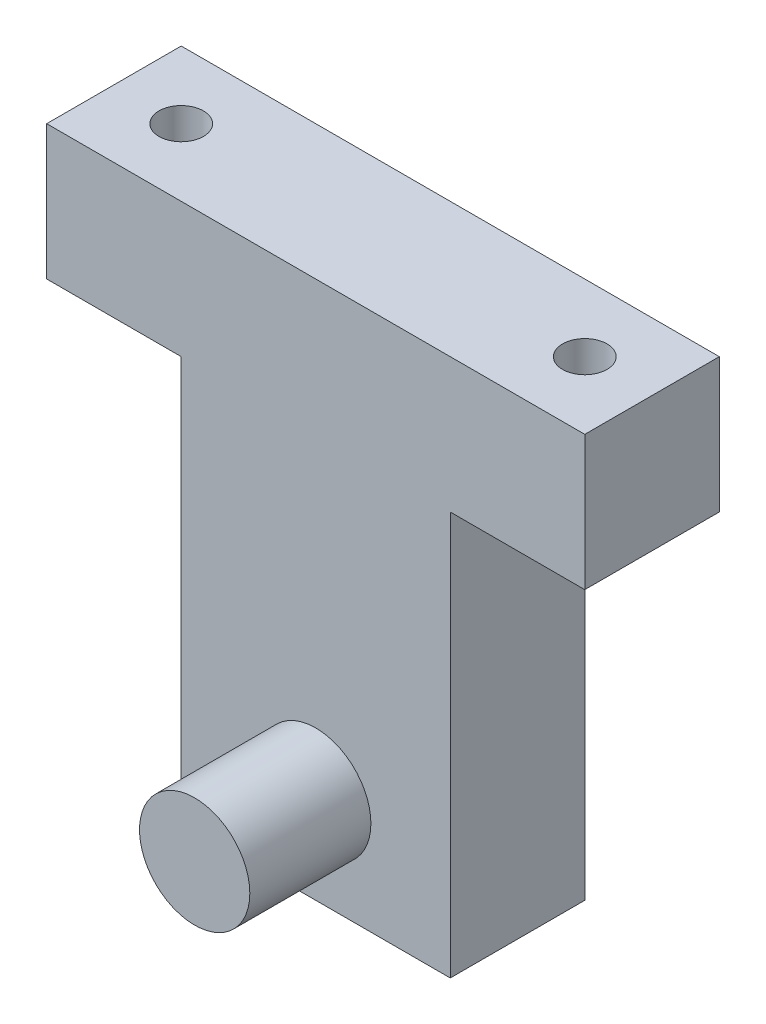
ISO-10303-21;
HEADER;
FILE_DESCRIPTION(('STEP AP214'),'2;1');
FILE_NAME('part.step','',(''),(''),'','','');
FILE_SCHEMA(('AUTOMOTIVE_DESIGN { 1 0 10303 214 1 1 1 1 }'));
ENDSEC;
DATA;
#1=APPLICATION_CONTEXT('core data for automotive mechanical design processes');
#2=APPLICATION_PROTOCOL_DEFINITION('international standard','automotive_design',2000,#1);
#3=PRODUCT_CONTEXT('',#1,'mechanical');
#4=PRODUCT('Part','Part','',(#3));
#5=PRODUCT_RELATED_PRODUCT_CATEGORY('part','',(#4));
#6=PRODUCT_DEFINITION_FORMATION('','',#4);
#7=PRODUCT_DEFINITION_CONTEXT('part definition',#1,'design');
#8=PRODUCT_DEFINITION('design','',#6,#7);
#9=PRODUCT_DEFINITION_SHAPE('','',#8);
#10=(LENGTH_UNIT() NAMED_UNIT(*) SI_UNIT(.MILLI.,.METRE.));
#11=(NAMED_UNIT(*) PLANE_ANGLE_UNIT() SI_UNIT($,.RADIAN.));
#12=(NAMED_UNIT(*) SI_UNIT($,.STERADIAN.) SOLID_ANGLE_UNIT());
#13=UNCERTAINTY_MEASURE_WITH_UNIT(LENGTH_MEASURE(1.E-05),#10,'distance_accuracy_value','');
#14=(GEOMETRIC_REPRESENTATION_CONTEXT(3) GLOBAL_UNCERTAINTY_ASSIGNED_CONTEXT((#13)) GLOBAL_UNIT_ASSIGNED_CONTEXT((#10,
#11,#12)) REPRESENTATION_CONTEXT('',''));
#15=CARTESIAN_POINT('',(0.,0.,0.));
#16=DIRECTION('',(0.,0.,1.));
#17=DIRECTION('',(1.,0.,0.));
#18=AXIS2_PLACEMENT_3D('',#15,#16,#17);
#19=CARTESIAN_POINT('',(0.,20.,10.));
#20=DIRECTION('',(0.,-1.,0.));
#21=DIRECTION('',(0.,0.,-1.));
#22=AXIS2_PLACEMENT_3D('',#19,#20,#21);
#23=PLANE('',#22);
#24=CARTESIAN_POINT('',(-15.,20.,5.));
#25=DIRECTION('',(0.,1.,0.));
#26=DIRECTION('',(0.,0.,1.));
#27=AXIS2_PLACEMENT_3D('',#24,#25,#26);
#28=CIRCLE('',#27,1.65);
#29=CARTESIAN_POINT('',(-15.,20.,6.65));
#30=VERTEX_POINT('',#29);
#31=EDGE_CURVE('E223',#30,#30,#28,.T.);
#32=ORIENTED_EDGE('',*,*,#31,.F.);
#33=EDGE_LOOP('',(#32));
#34=FACE_BOUND('',#33,.T.);
#35=CARTESIAN_POINT('',(15.,20.,5.));
#36=DIRECTION('',(0.,1.,0.));
#37=DIRECTION('',(0.,0.,-1.));
#38=AXIS2_PLACEMENT_3D('',#35,#36,#37);
#39=CIRCLE('',#38,1.65);
#40=CARTESIAN_POINT('',(15.,20.,3.35));
#41=VERTEX_POINT('',#40);
#42=EDGE_CURVE('E236',#41,#41,#39,.T.);
#43=ORIENTED_EDGE('',*,*,#42,.F.);
#44=EDGE_LOOP('',(#43));
#45=FACE_BOUND('',#44,.T.);
#46=DIRECTION('',(-1.,0.,0.));
#47=VECTOR('',#46,1.);
#48=CARTESIAN_POINT('',(0.,20.,0.));
#49=LINE('',#48,#47);
#50=CARTESIAN_POINT('',(20.,20.,0.));
#51=VERTEX_POINT('',#50);
#52=CARTESIAN_POINT('',(-20.,20.,0.));
#53=VERTEX_POINT('',#52);
#54=EDGE_CURVE('E151',#51,#53,#49,.T.);
#55=ORIENTED_EDGE('',*,*,#54,.T.);
#56=DIRECTION('',(0.,0.,-1.));
#57=VECTOR('',#56,1.);
#58=CARTESIAN_POINT('',(-20.,20.,10.));
#59=LINE('',#58,#57);
#60=CARTESIAN_POINT('',(-20.,20.,10.));
#61=VERTEX_POINT('',#60);
#62=EDGE_CURVE('E11',#61,#53,#59,.T.);
#63=ORIENTED_EDGE('',*,*,#62,.F.);
#64=DIRECTION('',(-1.,0.,0.));
#65=VECTOR('',#64,1.);
#66=CARTESIAN_POINT('',(0.,20.,10.));
#67=LINE('',#66,#65);
#68=CARTESIAN_POINT('',(20.,20.,10.));
#69=VERTEX_POINT('',#68);
#70=EDGE_CURVE('E178',#69,#61,#67,.T.);
#71=ORIENTED_EDGE('',*,*,#70,.F.);
#72=DIRECTION('',(0.,0.,-1.));
#73=VECTOR('',#72,1.);
#74=CARTESIAN_POINT('',(20.,20.,10.));
#75=LINE('',#74,#73);
#76=EDGE_CURVE('E62',#69,#51,#75,.T.);
#77=ORIENTED_EDGE('',*,*,#76,.T.);
#78=EDGE_LOOP('',(#55,#63,#71,#77));
#79=FACE_BOUND('',#78,.T.);
#80=ADVANCED_FACE('F45',(#34,#45,#79),#23,.F.);
#81=CARTESIAN_POINT('',(-20.,0.,10.));
#82=DIRECTION('',(1.,0.,0.));
#83=DIRECTION('',(0.,1.,0.));
#84=AXIS2_PLACEMENT_3D('',#81,#82,#83);
#85=PLANE('',#84);
#86=DIRECTION('',(0.,-1.,0.));
#87=VECTOR('',#86,1.);
#88=CARTESIAN_POINT('',(-20.,0.,0.));
#89=LINE('',#88,#87);
#90=CARTESIAN_POINT('',(-20.,10.,0.));
#91=VERTEX_POINT('',#90);
#92=EDGE_CURVE('E154',#53,#91,#89,.T.);
#93=ORIENTED_EDGE('',*,*,#92,.T.);
#94=DIRECTION('',(0.,0.,-1.));
#95=VECTOR('',#94,1.);
#96=CARTESIAN_POINT('',(-20.,10.,10.));
#97=LINE('',#96,#95);
#98=CARTESIAN_POINT('',(-20.,10.,10.));
#99=VERTEX_POINT('',#98);
#100=EDGE_CURVE('E54',#99,#91,#97,.T.);
#101=ORIENTED_EDGE('',*,*,#100,.F.);
#102=DIRECTION('',(0.,-1.,0.));
#103=VECTOR('',#102,1.);
#104=CARTESIAN_POINT('',(-20.,0.,10.));
#105=LINE('',#104,#103);
#106=EDGE_CURVE('E101',#61,#99,#105,.T.);
#107=ORIENTED_EDGE('',*,*,#106,.F.);
#108=ORIENTED_EDGE('',*,*,#62,.T.);
#109=EDGE_LOOP('',(#93,#101,#107,#108));
#110=FACE_BOUND('',#109,.T.);
#111=ADVANCED_FACE('F198',(#110),#85,.F.);
#112=CARTESIAN_POINT('',(0.,10.,10.));
#113=DIRECTION('',(0.,-1.,0.));
#114=DIRECTION('',(1.,0.,0.));
#115=AXIS2_PLACEMENT_3D('',#112,#113,#114);
#116=PLANE('',#115);
#117=CARTESIAN_POINT('',(-15.,10.,5.));
#118=DIRECTION('',(0.,1.,0.));
#119=DIRECTION('',(0.,0.,1.));
#120=AXIS2_PLACEMENT_3D('',#117,#118,#119);
#121=CIRCLE('',#120,1.65);
#122=CARTESIAN_POINT('',(-15.,10.,6.65));
#123=VERTEX_POINT('',#122);
#124=EDGE_CURVE('E226',#123,#123,#121,.T.);
#125=ORIENTED_EDGE('',*,*,#124,.T.);
#126=EDGE_LOOP('',(#125));
#127=FACE_BOUND('',#126,.T.);
#128=DIRECTION('',(-1.,0.,0.));
#129=VECTOR('',#128,1.);
#130=CARTESIAN_POINT('',(0.,10.,0.));
#131=LINE('',#130,#129);
#132=CARTESIAN_POINT('',(-10.,10.,0.));
#133=VERTEX_POINT('',#132);
#134=EDGE_CURVE('E159',#133,#91,#131,.T.);
#135=ORIENTED_EDGE('',*,*,#134,.F.);
#136=DIRECTION('',(0.,0.,-1.));
#137=VECTOR('',#136,1.);
#138=CARTESIAN_POINT('',(-10.,10.,10.));
#139=LINE('',#138,#137);
#140=CARTESIAN_POINT('',(-10.,10.,10.));
#141=VERTEX_POINT('',#140);
#142=EDGE_CURVE('E188',#141,#133,#139,.T.);
#143=ORIENTED_EDGE('',*,*,#142,.F.);
#144=DIRECTION('',(-1.,0.,0.));
#145=VECTOR('',#144,1.);
#146=CARTESIAN_POINT('',(0.,10.,10.));
#147=LINE('',#146,#145);
#148=EDGE_CURVE('E197',#141,#99,#147,.T.);
#149=ORIENTED_EDGE('',*,*,#148,.T.);
#150=ORIENTED_EDGE('',*,*,#100,.T.);
#151=EDGE_LOOP('',(#135,#143,#149,#150));
#152=FACE_BOUND('',#151,.T.);
#153=ADVANCED_FACE('F195',(#127,#152),#116,.T.);
#154=CARTESIAN_POINT('',(-10.,0.,10.));
#155=DIRECTION('',(-1.,0.,0.));
#156=DIRECTION('',(0.,0.,1.));
#157=AXIS2_PLACEMENT_3D('',#154,#155,#156);
#158=PLANE('',#157);
#159=DIRECTION('',(0.,1.,0.));
#160=VECTOR('',#159,1.);
#161=CARTESIAN_POINT('',(-10.,0.,0.));
#162=LINE('',#161,#160);
#163=CARTESIAN_POINT('',(-10.,-20.,0.));
#164=VERTEX_POINT('',#163);
#165=EDGE_CURVE('E163',#164,#133,#162,.T.);
#166=ORIENTED_EDGE('',*,*,#165,.F.);
#167=DIRECTION('',(0.,0.,-1.));
#168=VECTOR('',#167,1.);
#169=CARTESIAN_POINT('',(-10.,-20.,10.));
#170=LINE('',#169,#168);
#171=CARTESIAN_POINT('',(-10.,-20.,10.));
#172=VERTEX_POINT('',#171);
#173=EDGE_CURVE('E185',#172,#164,#170,.T.);
#174=ORIENTED_EDGE('',*,*,#173,.F.);
#175=DIRECTION('',(0.,1.,0.));
#176=VECTOR('',#175,1.);
#177=CARTESIAN_POINT('',(-10.,0.,10.));
#178=LINE('',#177,#176);
#179=EDGE_CURVE('E207',#172,#141,#178,.T.);
#180=ORIENTED_EDGE('',*,*,#179,.T.);
#181=ORIENTED_EDGE('',*,*,#142,.T.);
#182=EDGE_LOOP('',(#166,#174,#180,#181));
#183=FACE_BOUND('',#182,.T.);
#184=ADVANCED_FACE('F205',(#183),#158,.T.);
#185=CARTESIAN_POINT('',(0.,-20.,10.));
#186=DIRECTION('',(0.,1.,0.));
#187=DIRECTION('',(0.,0.,1.));
#188=AXIS2_PLACEMENT_3D('',#185,#186,#187);
#189=PLANE('',#188);
#190=DIRECTION('',(1.,0.,0.));
#191=VECTOR('',#190,1.);
#192=CARTESIAN_POINT('',(0.,-20.,0.));
#193=LINE('',#192,#191);
#194=CARTESIAN_POINT('',(10.,-20.,0.));
#195=VERTEX_POINT('',#194);
#196=EDGE_CURVE('E166',#164,#195,#193,.T.);
#197=ORIENTED_EDGE('',*,*,#196,.T.);
#198=DIRECTION('',(0.,0.,-1.));
#199=VECTOR('',#198,1.);
#200=CARTESIAN_POINT('',(10.,-20.,10.));
#201=LINE('',#200,#199);
#202=CARTESIAN_POINT('',(10.,-20.,10.));
#203=VERTEX_POINT('',#202);
#204=EDGE_CURVE('E138',#203,#195,#201,.T.);
#205=ORIENTED_EDGE('',*,*,#204,.F.);
#206=DIRECTION('',(1.,0.,0.));
#207=VECTOR('',#206,1.);
#208=CARTESIAN_POINT('',(0.,-20.,10.));
#209=LINE('',#208,#207);
#210=EDGE_CURVE('E124',#172,#203,#209,.T.);
#211=ORIENTED_EDGE('',*,*,#210,.F.);
#212=ORIENTED_EDGE('',*,*,#173,.T.);
#213=EDGE_LOOP('',(#197,#205,#211,#212));
#214=FACE_BOUND('',#213,.T.);
#215=ADVANCED_FACE('F366',(#214),#189,.F.);
#216=CARTESIAN_POINT('',(10.,0.,10.));
#217=DIRECTION('',(-1.,0.,0.));
#218=DIRECTION('',(0.,0.,1.));
#219=AXIS2_PLACEMENT_3D('',#216,#217,#218);
#220=PLANE('',#219);
#221=DIRECTION('',(0.,1.,0.));
#222=VECTOR('',#221,1.);
#223=CARTESIAN_POINT('',(10.,0.,0.));
#224=LINE('',#223,#222);
#225=CARTESIAN_POINT('',(10.,10.,0.));
#226=VERTEX_POINT('',#225);
#227=EDGE_CURVE('E134',#195,#226,#224,.T.);
#228=ORIENTED_EDGE('',*,*,#227,.T.);
#229=DIRECTION('',(0.,0.,-1.));
#230=VECTOR('',#229,1.);
#231=CARTESIAN_POINT('',(10.,10.,10.));
#232=LINE('',#231,#230);
#233=CARTESIAN_POINT('',(10.,10.,10.));
#234=VERTEX_POINT('',#233);
#235=EDGE_CURVE('E131',#234,#226,#232,.T.);
#236=ORIENTED_EDGE('',*,*,#235,.F.);
#237=DIRECTION('',(0.,1.,0.));
#238=VECTOR('',#237,1.);
#239=CARTESIAN_POINT('',(10.,0.,10.));
#240=LINE('',#239,#238);
#241=EDGE_CURVE('E116',#203,#234,#240,.T.);
#242=ORIENTED_EDGE('',*,*,#241,.F.);
#243=ORIENTED_EDGE('',*,*,#204,.T.);
#244=EDGE_LOOP('',(#228,#236,#242,#243));
#245=FACE_BOUND('',#244,.T.);
#246=ADVANCED_FACE('F132',(#245),#220,.F.);
#247=CARTESIAN_POINT('',(0.,10.,10.));
#248=DIRECTION('',(0.,1.,0.));
#249=DIRECTION('',(0.,0.,1.));
#250=AXIS2_PLACEMENT_3D('',#247,#248,#249);
#251=PLANE('',#250);
#252=CARTESIAN_POINT('',(15.,10.,5.));
#253=DIRECTION('',(0.,1.,0.));
#254=DIRECTION('',(0.,0.,-1.));
#255=AXIS2_PLACEMENT_3D('',#252,#253,#254);
#256=CIRCLE('',#255,1.65);
#257=CARTESIAN_POINT('',(15.,10.,3.35));
#258=VERTEX_POINT('',#257);
#259=EDGE_CURVE('E227',#258,#258,#256,.T.);
#260=ORIENTED_EDGE('',*,*,#259,.T.);
#261=EDGE_LOOP('',(#260));
#262=FACE_BOUND('',#261,.T.);
#263=DIRECTION('',(1.,0.,0.));
#264=VECTOR('',#263,1.);
#265=CARTESIAN_POINT('',(0.,10.,0.));
#266=LINE('',#265,#264);
#267=CARTESIAN_POINT('',(20.,10.,0.));
#268=VERTEX_POINT('',#267);
#269=EDGE_CURVE('E171',#226,#268,#266,.T.);
#270=ORIENTED_EDGE('',*,*,#269,.T.);
#271=DIRECTION('',(0.,0.,-1.));
#272=VECTOR('',#271,1.);
#273=CARTESIAN_POINT('',(20.,10.,10.));
#274=LINE('',#273,#272);
#275=CARTESIAN_POINT('',(20.,10.,10.));
#276=VERTEX_POINT('',#275);
#277=EDGE_CURVE('E89',#276,#268,#274,.T.);
#278=ORIENTED_EDGE('',*,*,#277,.F.);
#279=DIRECTION('',(1.,0.,0.));
#280=VECTOR('',#279,1.);
#281=CARTESIAN_POINT('',(0.,10.,10.));
#282=LINE('',#281,#280);
#283=EDGE_CURVE('E121',#234,#276,#282,.T.);
#284=ORIENTED_EDGE('',*,*,#283,.F.);
#285=ORIENTED_EDGE('',*,*,#235,.T.);
#286=EDGE_LOOP('',(#270,#278,#284,#285));
#287=FACE_BOUND('',#286,.T.);
#288=ADVANCED_FACE('F140',(#262,#287),#251,.F.);
#289=CARTESIAN_POINT('',(20.,0.,10.));
#290=DIRECTION('',(1.,0.,0.));
#291=DIRECTION('',(0.,1.,0.));
#292=AXIS2_PLACEMENT_3D('',#289,#290,#291);
#293=PLANE('',#292);
#294=DIRECTION('',(0.,-1.,0.));
#295=VECTOR('',#294,1.);
#296=CARTESIAN_POINT('',(20.,0.,0.));
#297=LINE('',#296,#295);
#298=EDGE_CURVE('E174',#51,#268,#297,.T.);
#299=ORIENTED_EDGE('',*,*,#298,.F.);
#300=ORIENTED_EDGE('',*,*,#76,.F.);
#301=DIRECTION('',(0.,-1.,0.));
#302=VECTOR('',#301,1.);
#303=CARTESIAN_POINT('',(20.,0.,10.));
#304=LINE('',#303,#302);
#305=EDGE_CURVE('E142',#69,#276,#304,.T.);
#306=ORIENTED_EDGE('',*,*,#305,.T.);
#307=ORIENTED_EDGE('',*,*,#277,.T.);
#308=EDGE_LOOP('',(#299,#300,#306,#307));
#309=FACE_BOUND('',#308,.T.);
#310=ADVANCED_FACE('F266',(#309),#293,.T.);
#311=CARTESIAN_POINT('',(0.,0.,10.));
#312=DIRECTION('',(0.,0.,1.));
#313=DIRECTION('',(1.,0.,0.));
#314=AXIS2_PLACEMENT_3D('',#311,#312,#313);
#315=PLANE('',#314);
#316=CARTESIAN_POINT('',(0.,-13.,10.));
#317=DIRECTION('',(0.,0.,1.));
#318=DIRECTION('',(1.,0.,0.));
#319=AXIS2_PLACEMENT_3D('',#316,#317,#318);
#320=CIRCLE('',#319,4.1);
#321=CARTESIAN_POINT('',(4.1,-13.,10.));
#322=VERTEX_POINT('',#321);
#323=EDGE_CURVE('E249',#322,#322,#320,.T.);
#324=ORIENTED_EDGE('',*,*,#323,.F.);
#325=EDGE_LOOP('',(#324));
#326=FACE_BOUND('',#325,.T.);
#327=ORIENTED_EDGE('',*,*,#70,.T.);
#328=ORIENTED_EDGE('',*,*,#106,.T.);
#329=ORIENTED_EDGE('',*,*,#148,.F.);
#330=ORIENTED_EDGE('',*,*,#179,.F.);
#331=ORIENTED_EDGE('',*,*,#210,.T.);
#332=ORIENTED_EDGE('',*,*,#241,.T.);
#333=ORIENTED_EDGE('',*,*,#283,.T.);
#334=ORIENTED_EDGE('',*,*,#305,.F.);
#335=EDGE_LOOP('',(#327,#328,#329,#330,#331,#332,#333,#334));
#336=FACE_BOUND('',#335,.T.);
#337=ADVANCED_FACE('F118',(#326,#336),#315,.T.);
#338=CARTESIAN_POINT('',(0.,0.,0.));
#339=DIRECTION('',(0.,0.,1.));
#340=DIRECTION('',(1.,0.,0.));
#341=AXIS2_PLACEMENT_3D('',#338,#339,#340);
#342=PLANE('',#341);
#343=ORIENTED_EDGE('',*,*,#54,.F.);
#344=ORIENTED_EDGE('',*,*,#298,.T.);
#345=ORIENTED_EDGE('',*,*,#269,.F.);
#346=ORIENTED_EDGE('',*,*,#227,.F.);
#347=ORIENTED_EDGE('',*,*,#196,.F.);
#348=ORIENTED_EDGE('',*,*,#165,.T.);
#349=ORIENTED_EDGE('',*,*,#134,.T.);
#350=ORIENTED_EDGE('',*,*,#92,.F.);
#351=EDGE_LOOP('',(#343,#344,#345,#346,#347,#348,#349,#350));
#352=FACE_BOUND('',#351,.T.);
#353=ADVANCED_FACE('F201',(#352),#342,.F.);
#354=CARTESIAN_POINT('',(0.,-13.,19.));
#355=DIRECTION('',(0.,0.,-1.));
#356=DIRECTION('',(-1.,0.,0.));
#357=AXIS2_PLACEMENT_3D('',#354,#355,#356);
#358=CYLINDRICAL_SURFACE('',#357,4.1);
#359=CARTESIAN_POINT('',(0.,-13.,19.));
#360=DIRECTION('',(0.,0.,1.));
#361=DIRECTION('',(1.,0.,0.));
#362=AXIS2_PLACEMENT_3D('',#359,#360,#361);
#363=CIRCLE('',#362,4.1);
#364=CARTESIAN_POINT('',(4.1,-13.,19.));
#365=VERTEX_POINT('',#364);
#366=EDGE_CURVE('E155',#365,#365,#363,.T.);
#367=ORIENTED_EDGE('',*,*,#366,.F.);
#368=EDGE_LOOP('',(#367));
#369=FACE_BOUND('',#368,.T.);
#370=ORIENTED_EDGE('',*,*,#323,.T.);
#371=EDGE_LOOP('',(#370));
#372=FACE_BOUND('',#371,.T.);
#373=ADVANCED_FACE('F299',(#369,#372),#358,.T.);
#374=CARTESIAN_POINT('',(0.,-13.,19.));
#375=DIRECTION('',(0.,0.,1.));
#376=DIRECTION('',(1.,0.,0.));
#377=AXIS2_PLACEMENT_3D('',#374,#375,#376);
#378=PLANE('',#377);
#379=ORIENTED_EDGE('',*,*,#366,.T.);
#380=EDGE_LOOP('',(#379));
#381=FACE_BOUND('',#380,.T.);
#382=ADVANCED_FACE('F290',(#381),#378,.T.);
#383=CARTESIAN_POINT('',(15.,10.,5.));
#384=DIRECTION('',(0.,1.,0.));
#385=DIRECTION('',(0.,0.,1.));
#386=AXIS2_PLACEMENT_3D('',#383,#384,#385);
#387=CYLINDRICAL_SURFACE('',#386,1.65);
#388=ORIENTED_EDGE('',*,*,#259,.F.);
#389=EDGE_LOOP('',(#388));
#390=FACE_BOUND('',#389,.T.);
#391=ORIENTED_EDGE('',*,*,#42,.T.);
#392=EDGE_LOOP('',(#391));
#393=FACE_BOUND('',#392,.T.);
#394=ADVANCED_FACE('F287',(#390,#393),#387,.F.);
#395=CARTESIAN_POINT('',(-15.,10.,5.));
#396=DIRECTION('',(0.,1.,0.));
#397=DIRECTION('',(0.,0.,1.));
#398=AXIS2_PLACEMENT_3D('',#395,#396,#397);
#399=CYLINDRICAL_SURFACE('',#398,1.65);
#400=ORIENTED_EDGE('',*,*,#124,.F.);
#401=EDGE_LOOP('',(#400));
#402=FACE_BOUND('',#401,.T.);
#403=ORIENTED_EDGE('',*,*,#31,.T.);
#404=EDGE_LOOP('',(#403));
#405=FACE_BOUND('',#404,.T.);
#406=ADVANCED_FACE('F289',(#402,#405),#399,.F.);
#407=CLOSED_SHELL('',(#80,#111,#153,#184,#215,#246,#288,#310,#337,#353,#373,#382,#394,#406));
#408=MANIFOLD_SOLID_BREP('B2',#407);
#409=ADVANCED_BREP_SHAPE_REPRESENTATION('',(#18,#408),#14);
#410=SHAPE_DEFINITION_REPRESENTATION(#9,#409);
ENDSEC;
END-ISO-10303-21;
